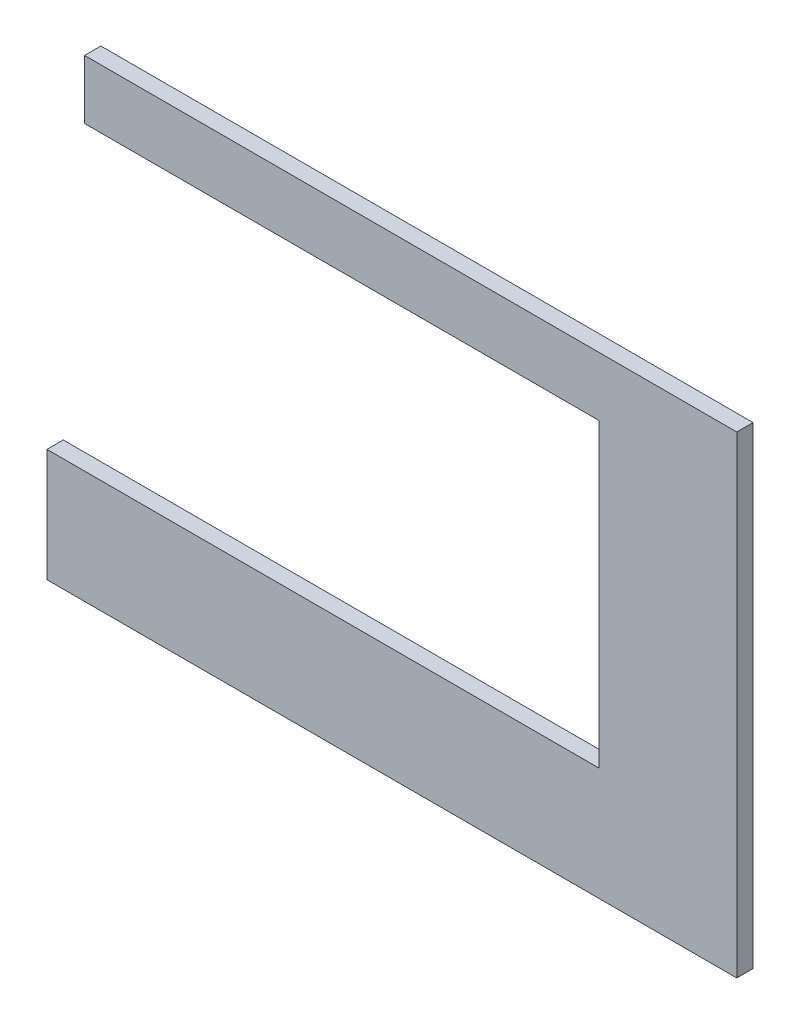
ISO-10303-21;
HEADER;
FILE_DESCRIPTION(('STEP AP214'),'2;1');
FILE_NAME('part.step','',(''),(''),'','','');
FILE_SCHEMA(('AUTOMOTIVE_DESIGN { 1 0 10303 214 1 1 1 1 }'));
ENDSEC;
DATA;
#1=APPLICATION_CONTEXT('core data for automotive mechanical design processes');
#2=APPLICATION_PROTOCOL_DEFINITION('international standard','automotive_design',2000,#1);
#3=PRODUCT_CONTEXT('',#1,'mechanical');
#4=PRODUCT('Part','Part','',(#3));
#5=PRODUCT_RELATED_PRODUCT_CATEGORY('part','',(#4));
#6=PRODUCT_DEFINITION_FORMATION('','',#4);
#7=PRODUCT_DEFINITION_CONTEXT('part definition',#1,'design');
#8=PRODUCT_DEFINITION('design','',#6,#7);
#9=PRODUCT_DEFINITION_SHAPE('','',#8);
#10=(LENGTH_UNIT() NAMED_UNIT(*) SI_UNIT(.MILLI.,.METRE.));
#11=(NAMED_UNIT(*) PLANE_ANGLE_UNIT() SI_UNIT($,.RADIAN.));
#12=(NAMED_UNIT(*) SI_UNIT($,.STERADIAN.) SOLID_ANGLE_UNIT());
#13=UNCERTAINTY_MEASURE_WITH_UNIT(LENGTH_MEASURE(1.E-05),#10,'distance_accuracy_value','');
#14=(GEOMETRIC_REPRESENTATION_CONTEXT(3) GLOBAL_UNCERTAINTY_ASSIGNED_CONTEXT((#13)) GLOBAL_UNIT_ASSIGNED_CONTEXT((#10,
#11,#12)) REPRESENTATION_CONTEXT('',''));
#15=CARTESIAN_POINT('',(0.,0.,0.));
#16=DIRECTION('',(0.,0.,1.));
#17=DIRECTION('',(1.,0.,0.));
#18=AXIS2_PLACEMENT_3D('',#15,#16,#17);
#19=CARTESIAN_POINT('',(6.15384615384512,-2.30769230769231,0.5));
#20=DIRECTION('',(0.,1.,0.));
#21=DIRECTION('',(0.,0.,1.));
#22=AXIS2_PLACEMENT_3D('',#19,#20,#21);
#23=PLANE('',#22);
#24=DIRECTION('',(-1.,0.,0.));
#25=VECTOR('',#24,1.);
#26=CARTESIAN_POINT('',(6.15384615384512,-2.30769230769231,1.));
#27=LINE('',#26,#25);
#28=CARTESIAN_POINT('',(6.15384615384512,-2.30769230769231,1.));
#29=VERTEX_POINT('',#28);
#30=CARTESIAN_POINT('',(-9.61538461538565,-2.30769230769231,1.));
#31=VERTEX_POINT('',#30);
#32=EDGE_CURVE('E91',#29,#31,#27,.T.);
#33=ORIENTED_EDGE('',*,*,#32,.T.);
#34=DIRECTION('',(0.,0.,1.));
#35=VECTOR('',#34,1.);
#36=CARTESIAN_POINT('',(-9.61538461538565,-2.30769230769231,0.5));
#37=LINE('',#36,#35);
#38=CARTESIAN_POINT('',(-9.61538461538565,-2.30769230769231,0.5));
#39=VERTEX_POINT('',#38);
#40=EDGE_CURVE('E140',#39,#31,#37,.T.);
#41=ORIENTED_EDGE('',*,*,#40,.F.);
#42=DIRECTION('',(-1.,0.,0.));
#43=VECTOR('',#42,1.);
#44=CARTESIAN_POINT('',(6.15384615384512,-2.30769230769231,0.5));
#45=LINE('',#44,#43);
#46=CARTESIAN_POINT('',(6.15384615384512,-2.30769230769231,0.5));
#47=VERTEX_POINT('',#46);
#48=EDGE_CURVE('E61',#47,#39,#45,.T.);
#49=ORIENTED_EDGE('',*,*,#48,.F.);
#50=DIRECTION('',(0.,0.,1.));
#51=VECTOR('',#50,1.);
#52=CARTESIAN_POINT('',(6.15384615384512,-2.30769230769231,0.5));
#53=LINE('',#52,#51);
#54=EDGE_CURVE('E126',#47,#29,#53,.T.);
#55=ORIENTED_EDGE('',*,*,#54,.T.);
#56=EDGE_LOOP('',(#33,#41,#49,#55));
#57=FACE_BOUND('',#56,.T.);
#58=ADVANCED_FACE('F39',(#57),#23,.F.);
#59=CARTESIAN_POINT('',(6.15384615384512,-11.5384615384615,0.5));
#60=DIRECTION('',(1.,0.,0.));
#61=DIRECTION('',(0.,0.,-1.));
#62=AXIS2_PLACEMENT_3D('',#59,#60,#61);
#63=PLANE('',#62);
#64=DIRECTION('',(0.,1.,0.));
#65=VECTOR('',#64,1.);
#66=CARTESIAN_POINT('',(6.15384615384512,-11.5384615384615,1.));
#67=LINE('',#66,#65);
#68=CARTESIAN_POINT('',(6.15384615384512,-11.5384615384615,1.));
#69=VERTEX_POINT('',#68);
#70=EDGE_CURVE('E144',#69,#29,#67,.T.);
#71=ORIENTED_EDGE('',*,*,#70,.T.);
#72=ORIENTED_EDGE('',*,*,#54,.F.);
#73=DIRECTION('',(0.,1.,0.));
#74=VECTOR('',#73,1.);
#75=CARTESIAN_POINT('',(6.15384615384512,-11.5384615384615,0.5));
#76=LINE('',#75,#74);
#77=CARTESIAN_POINT('',(6.15384615384512,-11.5384615384615,0.5));
#78=VERTEX_POINT('',#77);
#79=EDGE_CURVE('E115',#78,#47,#76,.T.);
#80=ORIENTED_EDGE('',*,*,#79,.F.);
#81=DIRECTION('',(0.,0.,1.));
#82=VECTOR('',#81,1.);
#83=CARTESIAN_POINT('',(6.15384615384512,-11.5384615384615,0.5));
#84=LINE('',#83,#82);
#85=EDGE_CURVE('E123',#78,#69,#84,.T.);
#86=ORIENTED_EDGE('',*,*,#85,.T.);
#87=EDGE_LOOP('',(#71,#72,#80,#86));
#88=FACE_BOUND('',#87,.T.);
#89=ADVANCED_FACE('F127',(#88),#63,.F.);
#90=CARTESIAN_POINT('',(-10.7692307692318,-11.5384615384615,0.5));
#91=DIRECTION('',(0.,-1.,0.));
#92=DIRECTION('',(0.,0.,-1.));
#93=AXIS2_PLACEMENT_3D('',#90,#91,#92);
#94=PLANE('',#93);
#95=DIRECTION('',(1.,0.,0.));
#96=VECTOR('',#95,1.);
#97=CARTESIAN_POINT('',(-10.7692307692318,-11.5384615384615,1.));
#98=LINE('',#97,#96);
#99=CARTESIAN_POINT('',(-10.7692307692318,-11.5384615384615,1.));
#100=VERTEX_POINT('',#99);
#101=EDGE_CURVE('E125',#100,#69,#98,.T.);
#102=ORIENTED_EDGE('',*,*,#101,.T.);
#103=ORIENTED_EDGE('',*,*,#85,.F.);
#104=DIRECTION('',(1.,0.,0.));
#105=VECTOR('',#104,1.);
#106=CARTESIAN_POINT('',(-10.7692307692318,-11.5384615384615,0.5));
#107=LINE('',#106,#105);
#108=CARTESIAN_POINT('',(-10.7692307692318,-11.5384615384615,0.5));
#109=VERTEX_POINT('',#108);
#110=EDGE_CURVE('E110',#109,#78,#107,.T.);
#111=ORIENTED_EDGE('',*,*,#110,.F.);
#112=DIRECTION('',(0.,0.,1.));
#113=VECTOR('',#112,1.);
#114=CARTESIAN_POINT('',(-10.7692307692318,-11.5384615384615,0.5));
#115=LINE('',#114,#113);
#116=EDGE_CURVE('E130',#109,#100,#115,.T.);
#117=ORIENTED_EDGE('',*,*,#116,.T.);
#118=EDGE_LOOP('',(#102,#103,#111,#117));
#119=FACE_BOUND('',#118,.T.);
#120=ADVANCED_FACE('F122',(#119),#94,.F.);
#121=CARTESIAN_POINT('',(-10.7692307692318,-15.,0.5));
#122=DIRECTION('',(1.,0.,0.));
#123=DIRECTION('',(0.,0.,-1.));
#124=AXIS2_PLACEMENT_3D('',#121,#122,#123);
#125=PLANE('',#124);
#126=DIRECTION('',(0.,1.,0.));
#127=VECTOR('',#126,1.);
#128=CARTESIAN_POINT('',(-10.7692307692318,-15.,1.));
#129=LINE('',#128,#127);
#130=CARTESIAN_POINT('',(-10.7692307692318,-15.,1.));
#131=VERTEX_POINT('',#130);
#132=EDGE_CURVE('E145',#131,#100,#129,.T.);
#133=ORIENTED_EDGE('',*,*,#132,.T.);
#134=ORIENTED_EDGE('',*,*,#116,.F.);
#135=DIRECTION('',(0.,1.,0.));
#136=VECTOR('',#135,1.);
#137=CARTESIAN_POINT('',(-10.7692307692318,-15.,0.5));
#138=LINE('',#137,#136);
#139=CARTESIAN_POINT('',(-10.7692307692318,-15.,0.5));
#140=VERTEX_POINT('',#139);
#141=EDGE_CURVE('E113',#140,#109,#138,.T.);
#142=ORIENTED_EDGE('',*,*,#141,.F.);
#143=DIRECTION('',(0.,0.,1.));
#144=VECTOR('',#143,1.);
#145=CARTESIAN_POINT('',(-10.7692307692318,-15.,0.5));
#146=LINE('',#145,#144);
#147=EDGE_CURVE('E155',#140,#131,#146,.T.);
#148=ORIENTED_EDGE('',*,*,#147,.T.);
#149=EDGE_LOOP('',(#133,#134,#142,#148));
#150=FACE_BOUND('',#149,.T.);
#151=ADVANCED_FACE('F170',(#150),#125,.F.);
#152=CARTESIAN_POINT('',(10.3846153846144,-15.,0.5));
#153=DIRECTION('',(0.,1.,0.));
#154=DIRECTION('',(0.,0.,1.));
#155=AXIS2_PLACEMENT_3D('',#152,#153,#154);
#156=PLANE('',#155);
#157=DIRECTION('',(-1.,0.,0.));
#158=VECTOR('',#157,1.);
#159=CARTESIAN_POINT('',(10.3846153846144,-15.,1.));
#160=LINE('',#159,#158);
#161=CARTESIAN_POINT('',(10.3846153846144,-15.,1.));
#162=VERTEX_POINT('',#161);
#163=EDGE_CURVE('E139',#162,#131,#160,.T.);
#164=ORIENTED_EDGE('',*,*,#163,.T.);
#165=ORIENTED_EDGE('',*,*,#147,.F.);
#166=DIRECTION('',(-1.,0.,0.));
#167=VECTOR('',#166,1.);
#168=CARTESIAN_POINT('',(10.3846153846144,-15.,0.5));
#169=LINE('',#168,#167);
#170=CARTESIAN_POINT('',(10.3846153846144,-15.,0.5));
#171=VERTEX_POINT('',#170);
#172=EDGE_CURVE('E165',#171,#140,#169,.T.);
#173=ORIENTED_EDGE('',*,*,#172,.F.);
#174=DIRECTION('',(0.,0.,1.));
#175=VECTOR('',#174,1.);
#176=CARTESIAN_POINT('',(10.3846153846144,-15.,0.5));
#177=LINE('',#176,#175);
#178=EDGE_CURVE('E43',#171,#162,#177,.T.);
#179=ORIENTED_EDGE('',*,*,#178,.T.);
#180=EDGE_LOOP('',(#164,#165,#173,#179));
#181=FACE_BOUND('',#180,.T.);
#182=ADVANCED_FACE('F164',(#181),#156,.F.);
#183=CARTESIAN_POINT('',(0.,0.,0.5));
#184=DIRECTION('',(0.,0.,-1.));
#185=DIRECTION('',(-1.,0.,0.));
#186=AXIS2_PLACEMENT_3D('',#183,#184,#185);
#187=PLANE('',#186);
#188=DIRECTION('',(-1.,0.,0.));
#189=VECTOR('',#188,1.);
#190=CARTESIAN_POINT('',(0.,-0.5,0.5));
#191=LINE('',#190,#189);
#192=CARTESIAN_POINT('',(10.3846153846144,-0.5,0.5));
#193=VERTEX_POINT('',#192);
#194=CARTESIAN_POINT('',(-9.61538461538565,-0.5,0.5));
#195=VERTEX_POINT('',#194);
#196=EDGE_CURVE('E180',#193,#195,#191,.T.);
#197=ORIENTED_EDGE('',*,*,#196,.F.);
#198=DIRECTION('',(0.,-1.,0.));
#199=VECTOR('',#198,1.);
#200=CARTESIAN_POINT('',(10.3846153846144,15.,0.5));
#201=LINE('',#200,#199);
#202=EDGE_CURVE('E97',#193,#171,#201,.T.);
#203=ORIENTED_EDGE('',*,*,#202,.T.);
#204=ORIENTED_EDGE('',*,*,#172,.T.);
#205=ORIENTED_EDGE('',*,*,#141,.T.);
#206=ORIENTED_EDGE('',*,*,#110,.T.);
#207=ORIENTED_EDGE('',*,*,#79,.T.);
#208=ORIENTED_EDGE('',*,*,#48,.T.);
#209=DIRECTION('',(0.,1.,0.));
#210=VECTOR('',#209,1.);
#211=CARTESIAN_POINT('',(-9.61538461538565,-2.30769230769231,0.5));
#212=LINE('',#211,#210);
#213=EDGE_CURVE('E135',#39,#195,#212,.T.);
#214=ORIENTED_EDGE('',*,*,#213,.T.);
#215=EDGE_LOOP('',(#197,#203,#204,#205,#206,#207,#208,#214));
#216=FACE_BOUND('',#215,.T.);
#217=ADVANCED_FACE('F108',(#216),#187,.T.);
#218=CARTESIAN_POINT('',(-9.61538461538565,-2.30769230769231,0.5));
#219=DIRECTION('',(1.,0.,0.));
#220=DIRECTION('',(0.,0.,-1.));
#221=AXIS2_PLACEMENT_3D('',#218,#219,#220);
#222=PLANE('',#221);
#223=DIRECTION('',(0.,1.,0.));
#224=VECTOR('',#223,1.);
#225=CARTESIAN_POINT('',(-9.61538461538565,-2.30769230769231,1.));
#226=LINE('',#225,#224);
#227=CARTESIAN_POINT('',(-9.61538461538565,-0.5,1.));
#228=VERTEX_POINT('',#227);
#229=EDGE_CURVE('E149',#31,#228,#226,.T.);
#230=ORIENTED_EDGE('',*,*,#229,.T.);
#231=DIRECTION('',(0.,0.,-1.));
#232=VECTOR('',#231,1.);
#233=CARTESIAN_POINT('',(-9.61538461538565,-0.5,0.5));
#234=LINE('',#233,#232);
#235=EDGE_CURVE('E174',#228,#195,#234,.T.);
#236=ORIENTED_EDGE('',*,*,#235,.T.);
#237=ORIENTED_EDGE('',*,*,#213,.F.);
#238=ORIENTED_EDGE('',*,*,#40,.T.);
#239=EDGE_LOOP('',(#230,#236,#237,#238));
#240=FACE_BOUND('',#239,.T.);
#241=ADVANCED_FACE('F183',(#240),#222,.F.);
#242=CARTESIAN_POINT('',(10.3846153846144,15.,0.5));
#243=DIRECTION('',(-1.,0.,0.));
#244=DIRECTION('',(0.,0.,1.));
#245=AXIS2_PLACEMENT_3D('',#242,#243,#244);
#246=PLANE('',#245);
#247=ORIENTED_EDGE('',*,*,#202,.F.);
#248=DIRECTION('',(0.,0.,1.));
#249=VECTOR('',#248,1.);
#250=CARTESIAN_POINT('',(10.3846153846144,-0.5,0.5));
#251=LINE('',#250,#249);
#252=CARTESIAN_POINT('',(10.3846153846144,-0.5,1.));
#253=VERTEX_POINT('',#252);
#254=EDGE_CURVE('E54',#193,#253,#251,.T.);
#255=ORIENTED_EDGE('',*,*,#254,.T.);
#256=DIRECTION('',(0.,-1.,0.));
#257=VECTOR('',#256,1.);
#258=CARTESIAN_POINT('',(10.3846153846144,15.,1.));
#259=LINE('',#258,#257);
#260=EDGE_CURVE('E138',#253,#162,#259,.T.);
#261=ORIENTED_EDGE('',*,*,#260,.T.);
#262=ORIENTED_EDGE('',*,*,#178,.F.);
#263=EDGE_LOOP('',(#247,#255,#261,#262));
#264=FACE_BOUND('',#263,.T.);
#265=ADVANCED_FACE('F41',(#264),#246,.F.);
#266=CARTESIAN_POINT('',(0.,0.,1.));
#267=DIRECTION('',(0.,0.,-1.));
#268=DIRECTION('',(-1.,0.,0.));
#269=AXIS2_PLACEMENT_3D('',#266,#267,#268);
#270=PLANE('',#269);
#271=ORIENTED_EDGE('',*,*,#260,.F.);
#272=DIRECTION('',(-1.,0.,0.));
#273=VECTOR('',#272,1.);
#274=CARTESIAN_POINT('',(-17.,-0.5,1.));
#275=LINE('',#274,#273);
#276=EDGE_CURVE('E11',#253,#228,#275,.T.);
#277=ORIENTED_EDGE('',*,*,#276,.T.);
#278=ORIENTED_EDGE('',*,*,#229,.F.);
#279=ORIENTED_EDGE('',*,*,#32,.F.);
#280=ORIENTED_EDGE('',*,*,#70,.F.);
#281=ORIENTED_EDGE('',*,*,#101,.F.);
#282=ORIENTED_EDGE('',*,*,#132,.F.);
#283=ORIENTED_EDGE('',*,*,#163,.F.);
#284=EDGE_LOOP('',(#271,#277,#278,#279,#280,#281,#282,#283));
#285=FACE_BOUND('',#284,.T.);
#286=ADVANCED_FACE('F167',(#285),#270,.F.);
#287=CARTESIAN_POINT('',(-17.,-0.5,1.));
#288=DIRECTION('',(0.,-1.,0.));
#289=DIRECTION('',(0.,0.,-1.));
#290=AXIS2_PLACEMENT_3D('',#287,#288,#289);
#291=PLANE('',#290);
#292=ORIENTED_EDGE('',*,*,#196,.T.);
#293=ORIENTED_EDGE('',*,*,#235,.F.);
#294=ORIENTED_EDGE('',*,*,#276,.F.);
#295=ORIENTED_EDGE('',*,*,#254,.F.);
#296=EDGE_LOOP('',(#292,#293,#294,#295));
#297=FACE_BOUND('',#296,.T.);
#298=ADVANCED_FACE('F177',(#297),#291,.F.);
#299=CLOSED_SHELL('',(#58,#89,#120,#151,#182,#217,#241,#265,#286,#298));
#300=MANIFOLD_SOLID_BREP('B2',#299);
#301=ADVANCED_BREP_SHAPE_REPRESENTATION('',(#18,#300),#14);
#302=SHAPE_DEFINITION_REPRESENTATION(#9,#301);
ENDSEC;
END-ISO-10303-21;
